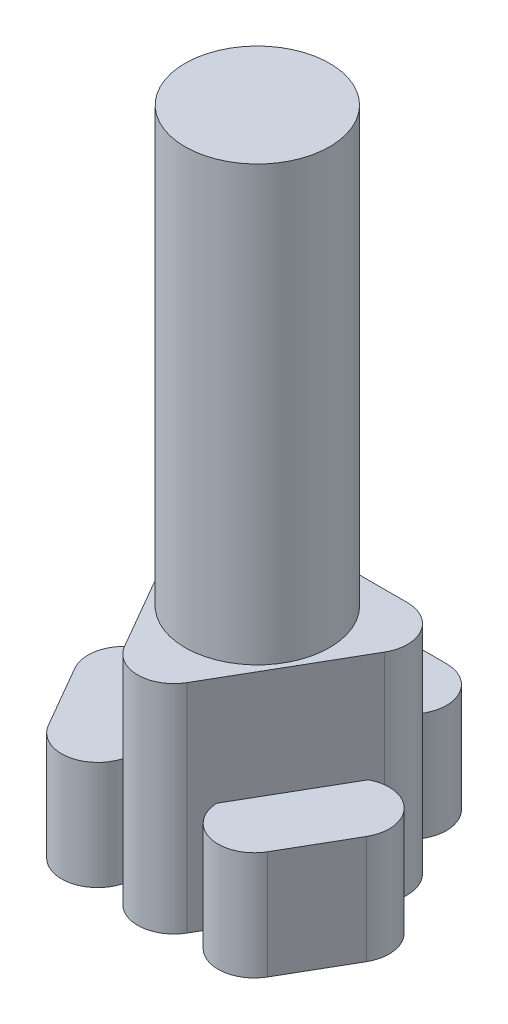
ISO-10303-21;
HEADER;
FILE_DESCRIPTION(('STEP AP214'),'2;1');
FILE_NAME('part.step','',(''),(''),'','','');
FILE_SCHEMA(('AUTOMOTIVE_DESIGN { 1 0 10303 214 1 1 1 1 }'));
ENDSEC;
DATA;
#1=APPLICATION_CONTEXT('core data for automotive mechanical design processes');
#2=APPLICATION_PROTOCOL_DEFINITION('international standard','automotive_design',2000,#1);
#3=PRODUCT_CONTEXT('',#1,'mechanical');
#4=PRODUCT('Part','Part','',(#3));
#5=PRODUCT_RELATED_PRODUCT_CATEGORY('part','',(#4));
#6=PRODUCT_DEFINITION_FORMATION('','',#4);
#7=PRODUCT_DEFINITION_CONTEXT('part definition',#1,'design');
#8=PRODUCT_DEFINITION('design','',#6,#7);
#9=PRODUCT_DEFINITION_SHAPE('','',#8);
#10=(LENGTH_UNIT() NAMED_UNIT(*) SI_UNIT(.MILLI.,.METRE.));
#11=(NAMED_UNIT(*) PLANE_ANGLE_UNIT() SI_UNIT($,.RADIAN.));
#12=(NAMED_UNIT(*) SI_UNIT($,.STERADIAN.) SOLID_ANGLE_UNIT());
#13=UNCERTAINTY_MEASURE_WITH_UNIT(LENGTH_MEASURE(1.E-05),#10,'distance_accuracy_value','');
#14=(GEOMETRIC_REPRESENTATION_CONTEXT(3) GLOBAL_UNCERTAINTY_ASSIGNED_CONTEXT((#13)) GLOBAL_UNIT_ASSIGNED_CONTEXT((#10,
#11,#12)) REPRESENTATION_CONTEXT('',''));
#15=CARTESIAN_POINT('',(0.,0.,0.));
#16=DIRECTION('',(0.,0.,1.));
#17=DIRECTION('',(1.,0.,0.));
#18=AXIS2_PLACEMENT_3D('',#15,#16,#17);
#19=CARTESIAN_POINT('',(-0.31650635094611,0.3,0.0517949192431128));
#20=DIRECTION('',(0.,-1.,0.));
#21=DIRECTION('',(0.,0.,-1.));
#22=AXIS2_PLACEMENT_3D('',#19,#20,#21);
#23=CYLINDRICAL_SURFACE('',#22,0.1);
#24=CARTESIAN_POINT('',(-0.31650635094611,0.,0.0517949192431128));
#25=DIRECTION('',(0.,1.,0.));
#26=DIRECTION('',(0.,0.,1.));
#27=AXIS2_PLACEMENT_3D('',#24,#25,#26);
#28=CIRCLE('',#27,0.1);
#29=CARTESIAN_POINT('',(-0.403108891324553,0.,0.101794919243113));
#30=VERTEX_POINT('',#29);
#31=CARTESIAN_POINT('',(-0.229903810567666,0.,0.00179491924311262));
#32=VERTEX_POINT('',#31);
#33=EDGE_CURVE('E109',#30,#32,#28,.F.);
#34=ORIENTED_EDGE('',*,*,#33,.F.);
#35=DIRECTION('',(0.,-1.,0.));
#36=VECTOR('',#35,1.);
#37=CARTESIAN_POINT('',(-0.403108891324553,0.3,0.101794919243113));
#38=LINE('',#37,#36);
#39=CARTESIAN_POINT('',(-0.403108891324553,0.3,0.101794919243113));
#40=VERTEX_POINT('',#39);
#41=EDGE_CURVE('E12',#40,#30,#38,.T.);
#42=ORIENTED_EDGE('',*,*,#41,.F.);
#43=CARTESIAN_POINT('',(-0.31650635094611,0.3,0.0517949192431128));
#44=DIRECTION('',(0.,1.,0.));
#45=DIRECTION('',(0.,0.,1.));
#46=AXIS2_PLACEMENT_3D('',#43,#44,#45);
#47=CIRCLE('',#46,0.1);
#48=CARTESIAN_POINT('',(-0.229903810567666,0.3,0.00179491924311262));
#49=VERTEX_POINT('',#48);
#50=EDGE_CURVE('E103',#40,#49,#47,.F.);
#51=ORIENTED_EDGE('',*,*,#50,.T.);
#52=DIRECTION('',(0.,-1.,0.));
#53=VECTOR('',#52,1.);
#54=CARTESIAN_POINT('',(-0.229903810567666,0.3,0.00179491924311262));
#55=LINE('',#54,#53);
#56=EDGE_CURVE('E84',#49,#32,#55,.T.);
#57=ORIENTED_EDGE('',*,*,#56,.T.);
#58=EDGE_LOOP('',(#34,#42,#51,#57));
#59=FACE_BOUND('',#58,.T.);
#60=ADVANCED_FACE('F46',(#59),#23,.T.);
#61=CARTESIAN_POINT('',(-0.346410161513776,0.3,0.199999999999999));
#62=DIRECTION('',(-0.86602540378444,0.,0.499999999999998));
#63=DIRECTION('',(0.499999999999998,0.,0.86602540378444));
#64=AXIS2_PLACEMENT_3D('',#61,#62,#63);
#65=PLANE('',#64);
#66=DIRECTION('',(-0.499999999999998,0.,-0.86602540378444));
#67=VECTOR('',#66,1.);
#68=CARTESIAN_POINT('',(-0.346410161513776,0.,0.199999999999999));
#69=LINE('',#68,#67);
#70=CARTESIAN_POINT('',(-0.303108891324554,0.,0.275000000000001));
#71=VERTEX_POINT('',#70);
#72=EDGE_CURVE('E97',#71,#30,#69,.T.);
#73=ORIENTED_EDGE('',*,*,#72,.F.);
#74=DIRECTION('',(0.,-1.,0.));
#75=VECTOR('',#74,1.);
#76=CARTESIAN_POINT('',(-0.303108891324554,0.3,0.275000000000001));
#77=LINE('',#76,#75);
#78=CARTESIAN_POINT('',(-0.303108891324554,0.3,0.275000000000001));
#79=VERTEX_POINT('',#78);
#80=EDGE_CURVE('E54',#79,#71,#77,.T.);
#81=ORIENTED_EDGE('',*,*,#80,.F.);
#82=DIRECTION('',(-0.499999999999998,0.,-0.86602540378444));
#83=VECTOR('',#82,1.);
#84=CARTESIAN_POINT('',(-0.346410161513776,0.3,0.199999999999999));
#85=LINE('',#84,#83);
#86=EDGE_CURVE('E95',#79,#40,#85,.T.);
#87=ORIENTED_EDGE('',*,*,#86,.T.);
#88=ORIENTED_EDGE('',*,*,#41,.T.);
#89=EDGE_LOOP('',(#73,#81,#87,#88));
#90=FACE_BOUND('',#89,.T.);
#91=ADVANCED_FACE('F93',(#90),#65,.T.);
#92=CARTESIAN_POINT('',(-0.21650635094611,0.3,0.225000000000001));
#93=DIRECTION('',(0.,-1.,0.));
#94=DIRECTION('',(0.,0.,-1.));
#95=AXIS2_PLACEMENT_3D('',#92,#93,#94);
#96=CYLINDRICAL_SURFACE('',#95,0.1);
#97=CARTESIAN_POINT('',(-0.21650635094611,0.,0.225000000000001));
#98=DIRECTION('',(0.,1.,0.));
#99=DIRECTION('',(0.,0.,1.));
#100=AXIS2_PLACEMENT_3D('',#97,#98,#99);
#101=CIRCLE('',#100,0.1);
#102=CARTESIAN_POINT('',(-0.129903810567666,0.,0.175000000000001));
#103=VERTEX_POINT('',#102);
#104=EDGE_CURVE('E77',#71,#103,#101,.T.);
#105=ORIENTED_EDGE('',*,*,#104,.T.);
#106=DIRECTION('',(0.,-1.,0.));
#107=VECTOR('',#106,1.);
#108=CARTESIAN_POINT('',(-0.129903810567666,0.3,0.175000000000001));
#109=LINE('',#108,#107);
#110=CARTESIAN_POINT('',(-0.129903810567666,0.3,0.175000000000001));
#111=VERTEX_POINT('',#110);
#112=EDGE_CURVE('E98',#111,#103,#109,.T.);
#113=ORIENTED_EDGE('',*,*,#112,.F.);
#114=CARTESIAN_POINT('',(-0.21650635094611,0.3,0.225000000000001));
#115=DIRECTION('',(0.,1.,0.));
#116=DIRECTION('',(0.,0.,1.));
#117=AXIS2_PLACEMENT_3D('',#114,#115,#116);
#118=CIRCLE('',#117,0.1);
#119=EDGE_CURVE('E99',#79,#111,#118,.T.);
#120=ORIENTED_EDGE('',*,*,#119,.F.);
#121=ORIENTED_EDGE('',*,*,#80,.T.);
#122=EDGE_LOOP('',(#105,#113,#120,#121));
#123=FACE_BOUND('',#122,.T.);
#124=ADVANCED_FACE('F100',(#123),#96,.T.);
#125=CARTESIAN_POINT('',(-0.173205080756888,0.3,0.0999999999999998));
#126=DIRECTION('',(-0.86602540378444,0.,0.499999999999998));
#127=DIRECTION('',(0.499999999999998,0.,0.86602540378444));
#128=AXIS2_PLACEMENT_3D('',#125,#126,#127);
#129=PLANE('',#128);
#130=DIRECTION('',(-0.499999999999998,0.,-0.86602540378444));
#131=VECTOR('',#130,1.);
#132=CARTESIAN_POINT('',(-0.173205080756888,0.,0.0999999999999998));
#133=LINE('',#132,#131);
#134=EDGE_CURVE('E105',#103,#32,#133,.T.);
#135=ORIENTED_EDGE('',*,*,#134,.T.);
#136=ORIENTED_EDGE('',*,*,#56,.F.);
#137=DIRECTION('',(-0.499999999999998,0.,-0.86602540378444));
#138=VECTOR('',#137,1.);
#139=CARTESIAN_POINT('',(-0.173205080756888,0.3,0.0999999999999998));
#140=LINE('',#139,#138);
#141=EDGE_CURVE('E62',#111,#49,#140,.T.);
#142=ORIENTED_EDGE('',*,*,#141,.F.);
#143=ORIENTED_EDGE('',*,*,#112,.T.);
#144=EDGE_LOOP('',(#135,#136,#142,#143));
#145=FACE_BOUND('',#144,.T.);
#146=ADVANCED_FACE('F118',(#145),#129,.F.);
#147=CARTESIAN_POINT('',(0.,0.3,0.));
#148=DIRECTION('',(0.,1.,0.));
#149=DIRECTION('',(0.,0.,1.));
#150=AXIS2_PLACEMENT_3D('',#147,#148,#149);
#151=PLANE('',#150);
#152=ORIENTED_EDGE('',*,*,#50,.F.);
#153=ORIENTED_EDGE('',*,*,#86,.F.);
#154=ORIENTED_EDGE('',*,*,#119,.T.);
#155=ORIENTED_EDGE('',*,*,#141,.T.);
#156=EDGE_LOOP('',(#152,#153,#154,#155));
#157=FACE_BOUND('',#156,.T.);
#158=ADVANCED_FACE('F102',(#157),#151,.T.);
#159=CARTESIAN_POINT('',(0.,0.,0.));
#160=DIRECTION('',(0.,1.,0.));
#161=DIRECTION('',(0.,0.,1.));
#162=AXIS2_PLACEMENT_3D('',#159,#160,#161);
#163=PLANE('',#162);
#164=ORIENTED_EDGE('',*,*,#33,.T.);
#165=ORIENTED_EDGE('',*,*,#134,.F.);
#166=ORIENTED_EDGE('',*,*,#104,.F.);
#167=ORIENTED_EDGE('',*,*,#72,.T.);
#168=EDGE_LOOP('',(#164,#165,#166,#167));
#169=FACE_BOUND('',#168,.T.);
#170=ADVANCED_FACE('F120',(#169),#163,.F.);
#171=CLOSED_SHELL('',(#60,#91,#124,#146,#158,#170));
#172=MANIFOLD_SOLID_BREP('B2',#171);
#173=CARTESIAN_POINT('',(0.216506350946111,0.3,0.224999999999999));
#174=DIRECTION('',(0.,-1.,0.));
#175=DIRECTION('',(0.,0.,-1.));
#176=AXIS2_PLACEMENT_3D('',#173,#174,#175);
#177=CYLINDRICAL_SURFACE('',#176,0.1);
#178=CARTESIAN_POINT('',(0.216506350946111,0.,0.224999999999999));
#179=DIRECTION('',(0.,1.,0.));
#180=DIRECTION('',(0.,0.,1.));
#181=AXIS2_PLACEMENT_3D('',#178,#179,#180);
#182=CIRCLE('',#181,0.1);
#183=CARTESIAN_POINT('',(0.303108891324555,0.,0.274999999999999));
#184=VERTEX_POINT('',#183);
#185=CARTESIAN_POINT('',(0.129903810567666,0.,0.175));
#186=VERTEX_POINT('',#185);
#187=EDGE_CURVE('E244',#184,#186,#182,.F.);
#188=ORIENTED_EDGE('',*,*,#187,.F.);
#189=DIRECTION('',(0.,-1.,0.));
#190=VECTOR('',#189,1.);
#191=CARTESIAN_POINT('',(0.303108891324555,0.3,0.274999999999999));
#192=LINE('',#191,#190);
#193=CARTESIAN_POINT('',(0.303108891324555,0.3,0.274999999999999));
#194=VERTEX_POINT('',#193);
#195=EDGE_CURVE('E44',#194,#184,#192,.T.);
#196=ORIENTED_EDGE('',*,*,#195,.F.);
#197=CARTESIAN_POINT('',(0.216506350946111,0.3,0.224999999999999));
#198=DIRECTION('',(0.,1.,0.));
#199=DIRECTION('',(0.,0.,1.));
#200=AXIS2_PLACEMENT_3D('',#197,#198,#199);
#201=CIRCLE('',#200,0.1);
#202=CARTESIAN_POINT('',(0.129903810567666,0.3,0.175));
#203=VERTEX_POINT('',#202);
#204=EDGE_CURVE('E238',#194,#203,#201,.F.);
#205=ORIENTED_EDGE('',*,*,#204,.T.);
#206=DIRECTION('',(0.,-1.,0.));
#207=VECTOR('',#206,1.);
#208=CARTESIAN_POINT('',(0.129903810567666,0.3,0.175));
#209=LINE('',#208,#207);
#210=EDGE_CURVE('E196',#203,#186,#209,.T.);
#211=ORIENTED_EDGE('',*,*,#210,.T.);
#212=EDGE_LOOP('',(#188,#196,#205,#211));
#213=FACE_BOUND('',#212,.T.);
#214=ADVANCED_FACE('F180',(#213),#177,.T.);
#215=CARTESIAN_POINT('',(0.346410161513776,0.3,0.199999999999999));
#216=DIRECTION('',(0.86602540378444,0.,0.499999999999998));
#217=DIRECTION('',(0.499999999999998,0.,-0.86602540378444));
#218=AXIS2_PLACEMENT_3D('',#215,#216,#217);
#219=PLANE('',#218);
#220=DIRECTION('',(-0.499999999999998,0.,0.86602540378444));
#221=VECTOR('',#220,1.);
#222=CARTESIAN_POINT('',(0.346410161513776,0.,0.199999999999999));
#223=LINE('',#222,#221);
#224=CARTESIAN_POINT('',(0.403108891324554,0.,0.101794919243111));
#225=VERTEX_POINT('',#224);
#226=EDGE_CURVE('E228',#225,#184,#223,.T.);
#227=ORIENTED_EDGE('',*,*,#226,.F.);
#228=DIRECTION('',(0.,-1.,0.));
#229=VECTOR('',#228,1.);
#230=CARTESIAN_POINT('',(0.403108891324554,0.3,0.101794919243111));
#231=LINE('',#230,#229);
#232=CARTESIAN_POINT('',(0.403108891324554,0.3,0.101794919243111));
#233=VERTEX_POINT('',#232);
#234=EDGE_CURVE('E188',#233,#225,#231,.T.);
#235=ORIENTED_EDGE('',*,*,#234,.F.);
#236=DIRECTION('',(-0.499999999999998,0.,0.86602540378444));
#237=VECTOR('',#236,1.);
#238=CARTESIAN_POINT('',(0.346410161513776,0.3,0.199999999999999));
#239=LINE('',#238,#237);
#240=EDGE_CURVE('E226',#233,#194,#239,.T.);
#241=ORIENTED_EDGE('',*,*,#240,.T.);
#242=ORIENTED_EDGE('',*,*,#195,.T.);
#243=EDGE_LOOP('',(#227,#235,#241,#242));
#244=FACE_BOUND('',#243,.T.);
#245=ADVANCED_FACE('F224',(#244),#219,.T.);
#246=CARTESIAN_POINT('',(0.31650635094611,0.3,0.051794919243111));
#247=DIRECTION('',(0.,-1.,0.));
#248=DIRECTION('',(0.,0.,-1.));
#249=AXIS2_PLACEMENT_3D('',#246,#247,#248);
#250=CYLINDRICAL_SURFACE('',#249,0.1);
#251=CARTESIAN_POINT('',(0.31650635094611,0.,0.051794919243111));
#252=DIRECTION('',(0.,1.,0.));
#253=DIRECTION('',(0.,0.,1.));
#254=AXIS2_PLACEMENT_3D('',#251,#252,#253);
#255=CIRCLE('',#254,0.1);
#256=CARTESIAN_POINT('',(0.229903810567666,0.,0.00179491924311166));
#257=VERTEX_POINT('',#256);
#258=EDGE_CURVE('E247',#225,#257,#255,.T.);
#259=ORIENTED_EDGE('',*,*,#258,.T.);
#260=DIRECTION('',(0.,-1.,0.));
#261=VECTOR('',#260,1.);
#262=CARTESIAN_POINT('',(0.229903810567666,0.3,0.00179491924311166));
#263=LINE('',#262,#261);
#264=CARTESIAN_POINT('',(0.229903810567666,0.3,0.00179491924311166));
#265=VERTEX_POINT('',#264);
#266=EDGE_CURVE('E210',#265,#257,#263,.T.);
#267=ORIENTED_EDGE('',*,*,#266,.F.);
#268=CARTESIAN_POINT('',(0.31650635094611,0.3,0.051794919243111));
#269=DIRECTION('',(0.,1.,0.));
#270=DIRECTION('',(0.,0.,1.));
#271=AXIS2_PLACEMENT_3D('',#268,#269,#270);
#272=CIRCLE('',#271,0.1);
#273=EDGE_CURVE('E231',#233,#265,#272,.T.);
#274=ORIENTED_EDGE('',*,*,#273,.F.);
#275=ORIENTED_EDGE('',*,*,#234,.T.);
#276=EDGE_LOOP('',(#259,#267,#274,#275));
#277=FACE_BOUND('',#276,.T.);
#278=ADVANCED_FACE('F232',(#277),#250,.T.);
#279=CARTESIAN_POINT('',(0.173205080756888,0.3,0.0999999999999998));
#280=DIRECTION('',(-0.866025403784439,0.,-0.499999999999999));
#281=DIRECTION('',(-0.499999999999999,0.,0.866025403784439));
#282=AXIS2_PLACEMENT_3D('',#279,#280,#281);
#283=PLANE('',#282);
#284=DIRECTION('',(0.499999999999999,0.,-0.86602540378444));
#285=VECTOR('',#284,1.);
#286=CARTESIAN_POINT('',(0.173205080756888,0.,0.0999999999999998));
#287=LINE('',#286,#285);
#288=EDGE_CURVE('E240',#186,#257,#287,.T.);
#289=ORIENTED_EDGE('',*,*,#288,.F.);
#290=ORIENTED_EDGE('',*,*,#210,.F.);
#291=DIRECTION('',(0.499999999999999,0.,-0.86602540378444));
#292=VECTOR('',#291,1.);
#293=CARTESIAN_POINT('',(0.173205080756888,0.3,0.0999999999999998));
#294=LINE('',#293,#292);
#295=EDGE_CURVE('E235',#203,#265,#294,.T.);
#296=ORIENTED_EDGE('',*,*,#295,.T.);
#297=ORIENTED_EDGE('',*,*,#266,.T.);
#298=EDGE_LOOP('',(#289,#290,#296,#297));
#299=FACE_BOUND('',#298,.T.);
#300=ADVANCED_FACE('F254',(#299),#283,.T.);
#301=CARTESIAN_POINT('',(0.,0.3,0.));
#302=DIRECTION('',(0.,1.,0.));
#303=DIRECTION('',(0.,0.,1.));
#304=AXIS2_PLACEMENT_3D('',#301,#302,#303);
#305=PLANE('',#304);
#306=ORIENTED_EDGE('',*,*,#204,.F.);
#307=ORIENTED_EDGE('',*,*,#240,.F.);
#308=ORIENTED_EDGE('',*,*,#273,.T.);
#309=ORIENTED_EDGE('',*,*,#295,.F.);
#310=EDGE_LOOP('',(#306,#307,#308,#309));
#311=FACE_BOUND('',#310,.T.);
#312=ADVANCED_FACE('F237',(#311),#305,.T.);
#313=CARTESIAN_POINT('',(0.,0.,0.));
#314=DIRECTION('',(0.,1.,0.));
#315=DIRECTION('',(0.,0.,1.));
#316=AXIS2_PLACEMENT_3D('',#313,#314,#315);
#317=PLANE('',#316);
#318=ORIENTED_EDGE('',*,*,#187,.T.);
#319=ORIENTED_EDGE('',*,*,#288,.T.);
#320=ORIENTED_EDGE('',*,*,#258,.F.);
#321=ORIENTED_EDGE('',*,*,#226,.T.);
#322=EDGE_LOOP('',(#318,#319,#320,#321));
#323=FACE_BOUND('',#322,.T.);
#324=ADVANCED_FACE('F253',(#323),#317,.F.);
#325=CLOSED_SHELL('',(#214,#245,#278,#300,#312,#324));
#326=MANIFOLD_SOLID_BREP('B6',#325);
#327=CARTESIAN_POINT('',(0.,0.3,-0.223205080756888));
#328=DIRECTION('',(0.,0.,1.));
#329=DIRECTION('',(1.,0.,0.));
#330=AXIS2_PLACEMENT_3D('',#327,#328,#329);
#331=PLANE('',#330);
#332=DIRECTION('',(-1.,0.,0.));
#333=VECTOR('',#332,1.);
#334=CARTESIAN_POINT('',(0.,0.,-0.223205080756888));
#335=LINE('',#334,#333);
#336=CARTESIAN_POINT('',(0.0999999999999999,0.,-0.223205080756888));
#337=VERTEX_POINT('',#336);
#338=CARTESIAN_POINT('',(-0.1,0.,-0.223205080756888));
#339=VERTEX_POINT('',#338);
#340=EDGE_CURVE('E376',#337,#339,#335,.T.);
#341=ORIENTED_EDGE('',*,*,#340,.F.);
#342=DIRECTION('',(0.,-1.,0.));
#343=VECTOR('',#342,1.);
#344=CARTESIAN_POINT('',(0.0999999999999999,0.3,-0.223205080756888));
#345=LINE('',#344,#343);
#346=CARTESIAN_POINT('',(0.0999999999999999,0.3,-0.223205080756888));
#347=VERTEX_POINT('',#346);
#348=EDGE_CURVE('E178',#347,#337,#345,.T.);
#349=ORIENTED_EDGE('',*,*,#348,.F.);
#350=DIRECTION('',(-1.,0.,0.));
#351=VECTOR('',#350,1.);
#352=CARTESIAN_POINT('',(0.,0.3,-0.223205080756888));
#353=LINE('',#352,#351);
#354=CARTESIAN_POINT('',(-0.1,0.3,-0.223205080756888));
#355=VERTEX_POINT('',#354);
#356=EDGE_CURVE('E361',#347,#355,#353,.T.);
#357=ORIENTED_EDGE('',*,*,#356,.T.);
#358=DIRECTION('',(0.,-1.,0.));
#359=VECTOR('',#358,1.);
#360=CARTESIAN_POINT('',(-0.1,0.3,-0.223205080756888));
#361=LINE('',#360,#359);
#362=EDGE_CURVE('E329',#355,#339,#361,.T.);
#363=ORIENTED_EDGE('',*,*,#362,.T.);
#364=EDGE_LOOP('',(#341,#349,#357,#363));
#365=FACE_BOUND('',#364,.T.);
#366=ADVANCED_FACE('F313',(#365),#331,.T.);
#367=CARTESIAN_POINT('',(0.0999999999999995,0.3,-0.323205080756888));
#368=DIRECTION('',(0.,-1.,0.));
#369=DIRECTION('',(0.,0.,-1.));
#370=AXIS2_PLACEMENT_3D('',#367,#368,#369);
#371=CYLINDRICAL_SURFACE('',#370,0.1);
#372=CARTESIAN_POINT('',(0.0999999999999995,0.,-0.323205080756888));
#373=DIRECTION('',(0.,1.,0.));
#374=DIRECTION('',(0.,0.,1.));
#375=AXIS2_PLACEMENT_3D('',#372,#373,#374);
#376=CIRCLE('',#375,0.1);
#377=CARTESIAN_POINT('',(0.0999999999999992,0.,-0.423205080756888));
#378=VERTEX_POINT('',#377);
#379=EDGE_CURVE('E367',#337,#378,#376,.T.);
#380=ORIENTED_EDGE('',*,*,#379,.T.);
#381=DIRECTION('',(0.,-1.,0.));
#382=VECTOR('',#381,1.);
#383=CARTESIAN_POINT('',(0.0999999999999992,0.3,-0.423205080756888));
#384=LINE('',#383,#382);
#385=CARTESIAN_POINT('',(0.0999999999999992,0.3,-0.423205080756888));
#386=VERTEX_POINT('',#385);
#387=EDGE_CURVE('E321',#386,#378,#384,.T.);
#388=ORIENTED_EDGE('',*,*,#387,.F.);
#389=CARTESIAN_POINT('',(0.0999999999999995,0.3,-0.323205080756888));
#390=DIRECTION('',(0.,1.,0.));
#391=DIRECTION('',(0.,0.,1.));
#392=AXIS2_PLACEMENT_3D('',#389,#390,#391);
#393=CIRCLE('',#392,0.1);
#394=EDGE_CURVE('E355',#347,#386,#393,.T.);
#395=ORIENTED_EDGE('',*,*,#394,.F.);
#396=ORIENTED_EDGE('',*,*,#348,.T.);
#397=EDGE_LOOP('',(#380,#388,#395,#396));
#398=FACE_BOUND('',#397,.T.);
#399=ADVANCED_FACE('F365',(#398),#371,.T.);
#400=CARTESIAN_POINT('',(0.,0.3,-0.423205080756888));
#401=DIRECTION('',(0.,0.,1.));
#402=DIRECTION('',(1.,0.,0.));
#403=AXIS2_PLACEMENT_3D('',#400,#401,#402);
#404=PLANE('',#403);
#405=DIRECTION('',(-1.,0.,0.));
#406=VECTOR('',#405,1.);
#407=CARTESIAN_POINT('',(0.,0.,-0.423205080756888));
#408=LINE('',#407,#406);
#409=CARTESIAN_POINT('',(-0.100000000000001,0.,-0.423205080756888));
#410=VERTEX_POINT('',#409);
#411=EDGE_CURVE('E379',#378,#410,#408,.T.);
#412=ORIENTED_EDGE('',*,*,#411,.T.);
#413=DIRECTION('',(0.,-1.,0.));
#414=VECTOR('',#413,1.);
#415=CARTESIAN_POINT('',(-0.100000000000001,0.3,-0.423205080756888));
#416=LINE('',#415,#414);
#417=CARTESIAN_POINT('',(-0.100000000000001,0.3,-0.423205080756888));
#418=VERTEX_POINT('',#417);
#419=EDGE_CURVE('E343',#418,#410,#416,.T.);
#420=ORIENTED_EDGE('',*,*,#419,.F.);
#421=DIRECTION('',(-1.,0.,0.));
#422=VECTOR('',#421,1.);
#423=CARTESIAN_POINT('',(0.,0.3,-0.423205080756888));
#424=LINE('',#423,#422);
#425=EDGE_CURVE('E360',#386,#418,#424,.T.);
#426=ORIENTED_EDGE('',*,*,#425,.F.);
#427=ORIENTED_EDGE('',*,*,#387,.T.);
#428=EDGE_LOOP('',(#412,#420,#426,#427));
#429=FACE_BOUND('',#428,.T.);
#430=ADVANCED_FACE('F370',(#429),#404,.F.);
#431=CARTESIAN_POINT('',(-0.100000000000001,0.3,-0.323205080756888));
#432=DIRECTION('',(0.,-1.,0.));
#433=DIRECTION('',(0.,0.,-1.));
#434=AXIS2_PLACEMENT_3D('',#431,#432,#433);
#435=CYLINDRICAL_SURFACE('',#434,0.1);
#436=CARTESIAN_POINT('',(-0.100000000000001,0.,-0.323205080756888));
#437=DIRECTION('',(0.,1.,0.));
#438=DIRECTION('',(0.,0.,1.));
#439=AXIS2_PLACEMENT_3D('',#436,#437,#438);
#440=CIRCLE('',#439,0.1);
#441=EDGE_CURVE('E381',#339,#410,#440,.F.);
#442=ORIENTED_EDGE('',*,*,#441,.F.);
#443=ORIENTED_EDGE('',*,*,#362,.F.);
#444=CARTESIAN_POINT('',(-0.100000000000001,0.3,-0.323205080756888));
#445=DIRECTION('',(0.,1.,0.));
#446=DIRECTION('',(0.,0.,1.));
#447=AXIS2_PLACEMENT_3D('',#444,#445,#446);
#448=CIRCLE('',#447,0.1);
#449=EDGE_CURVE('E371',#355,#418,#448,.F.);
#450=ORIENTED_EDGE('',*,*,#449,.T.);
#451=ORIENTED_EDGE('',*,*,#419,.T.);
#452=EDGE_LOOP('',(#442,#443,#450,#451));
#453=FACE_BOUND('',#452,.T.);
#454=ADVANCED_FACE('F386',(#453),#435,.T.);
#455=CARTESIAN_POINT('',(0.,0.3,0.));
#456=DIRECTION('',(0.,1.,0.));
#457=DIRECTION('',(0.,0.,1.));
#458=AXIS2_PLACEMENT_3D('',#455,#456,#457);
#459=PLANE('',#458);
#460=ORIENTED_EDGE('',*,*,#356,.F.);
#461=ORIENTED_EDGE('',*,*,#394,.T.);
#462=ORIENTED_EDGE('',*,*,#425,.T.);
#463=ORIENTED_EDGE('',*,*,#449,.F.);
#464=EDGE_LOOP('',(#460,#461,#462,#463));
#465=FACE_BOUND('',#464,.T.);
#466=ADVANCED_FACE('F357',(#465),#459,.T.);
#467=CARTESIAN_POINT('',(0.,0.,0.));
#468=DIRECTION('',(0.,1.,0.));
#469=DIRECTION('',(0.,0.,1.));
#470=AXIS2_PLACEMENT_3D('',#467,#468,#469);
#471=PLANE('',#470);
#472=ORIENTED_EDGE('',*,*,#340,.T.);
#473=ORIENTED_EDGE('',*,*,#441,.T.);
#474=ORIENTED_EDGE('',*,*,#411,.F.);
#475=ORIENTED_EDGE('',*,*,#379,.F.);
#476=EDGE_LOOP('',(#472,#473,#474,#475));
#477=FACE_BOUND('',#476,.T.);
#478=ADVANCED_FACE('F393',(#477),#471,.F.);
#479=CLOSED_SHELL('',(#366,#399,#430,#454,#466,#478));
#480=MANIFOLD_SOLID_BREP('B38',#479);
#481=CARTESIAN_POINT('',(0.2,0.6,-0.115470053837925));
#482=DIRECTION('',(0.,-1.,0.));
#483=DIRECTION('',(0.,0.,-1.));
#484=AXIS2_PLACEMENT_3D('',#481,#482,#483);
#485=CYLINDRICAL_SURFACE('',#484,0.1);
#486=CARTESIAN_POINT('',(0.2,0.,-0.115470053837925));
#487=DIRECTION('',(0.,1.,0.));
#488=DIRECTION('',(0.,0.,1.));
#489=AXIS2_PLACEMENT_3D('',#486,#487,#488);
#490=CIRCLE('',#489,0.1);
#491=CARTESIAN_POINT('',(0.286602540378444,0.,-0.0654700538379251));
#492=VERTEX_POINT('',#491);
#493=CARTESIAN_POINT('',(0.2,0.,-0.215470053837925));
#494=VERTEX_POINT('',#493);
#495=EDGE_CURVE('E521',#492,#494,#490,.T.);
#496=ORIENTED_EDGE('',*,*,#495,.T.);
#497=DIRECTION('',(0.,-1.,0.));
#498=VECTOR('',#497,1.);
#499=CARTESIAN_POINT('',(0.2,0.6,-0.215470053837925));
#500=LINE('',#499,#498);
#501=CARTESIAN_POINT('',(0.2,0.6,-0.215470053837925));
#502=VERTEX_POINT('',#501);
#503=EDGE_CURVE('E311',#502,#494,#500,.T.);
#504=ORIENTED_EDGE('',*,*,#503,.F.);
#505=CARTESIAN_POINT('',(0.2,0.6,-0.115470053837925));
#506=DIRECTION('',(0.,1.,0.));
#507=DIRECTION('',(0.,0.,1.));
#508=AXIS2_PLACEMENT_3D('',#505,#506,#507);
#509=CIRCLE('',#508,0.1);
#510=CARTESIAN_POINT('',(0.286602540378444,0.6,-0.0654700538379251));
#511=VERTEX_POINT('',#510);
#512=EDGE_CURVE('E532',#511,#502,#509,.T.);
#513=ORIENTED_EDGE('',*,*,#512,.F.);
#514=DIRECTION('',(0.,-1.,0.));
#515=VECTOR('',#514,1.);
#516=CARTESIAN_POINT('',(0.286602540378444,0.6,-0.0654700538379251));
#517=LINE('',#516,#515);
#518=EDGE_CURVE('E517',#511,#492,#517,.T.);
#519=ORIENTED_EDGE('',*,*,#518,.T.);
#520=EDGE_LOOP('',(#496,#504,#513,#519));
#521=FACE_BOUND('',#520,.T.);
#522=ADVANCED_FACE('F437',(#521),#485,.T.);
#523=CARTESIAN_POINT('',(0.2,0.6,-0.215470053837925));
#524=DIRECTION('',(0.,0.,1.));
#525=DIRECTION('',(1.,0.,0.));
#526=AXIS2_PLACEMENT_3D('',#523,#524,#525);
#527=PLANE('',#526);
#528=DIRECTION('',(-1.,0.,0.));
#529=VECTOR('',#528,1.);
#530=CARTESIAN_POINT('',(0.2,0.,-0.215470053837925));
#531=LINE('',#530,#529);
#532=CARTESIAN_POINT('',(-0.2,0.,-0.215470053837925));
#533=VERTEX_POINT('',#532);
#534=EDGE_CURVE('E524',#494,#533,#531,.T.);
#535=ORIENTED_EDGE('',*,*,#534,.T.);
#536=DIRECTION('',(0.,-1.,0.));
#537=VECTOR('',#536,1.);
#538=CARTESIAN_POINT('',(-0.2,0.6,-0.215470053837925));
#539=LINE('',#538,#537);
#540=CARTESIAN_POINT('',(-0.2,0.6,-0.215470053837925));
#541=VERTEX_POINT('',#540);
#542=EDGE_CURVE('E445',#541,#533,#539,.T.);
#543=ORIENTED_EDGE('',*,*,#542,.F.);
#544=DIRECTION('',(-1.,0.,0.));
#545=VECTOR('',#544,1.);
#546=CARTESIAN_POINT('',(0.2,0.6,-0.215470053837925));
#547=LINE('',#546,#545);
#548=EDGE_CURVE('E490',#502,#541,#547,.T.);
#549=ORIENTED_EDGE('',*,*,#548,.F.);
#550=ORIENTED_EDGE('',*,*,#503,.T.);
#551=EDGE_LOOP('',(#535,#543,#549,#550));
#552=FACE_BOUND('',#551,.T.);
#553=ADVANCED_FACE('F557',(#552),#527,.F.);
#554=CARTESIAN_POINT('',(-0.2,0.6,-0.115470053837925));
#555=DIRECTION('',(0.,-1.,0.));
#556=DIRECTION('',(0.,0.,-1.));
#557=AXIS2_PLACEMENT_3D('',#554,#555,#556);
#558=CYLINDRICAL_SURFACE('',#557,0.1);
#559=CARTESIAN_POINT('',(-0.2,0.,-0.115470053837925));
#560=DIRECTION('',(0.,1.,0.));
#561=DIRECTION('',(0.,0.,1.));
#562=AXIS2_PLACEMENT_3D('',#559,#560,#561);
#563=CIRCLE('',#562,0.1);
#564=CARTESIAN_POINT('',(-0.286602540378444,0.,-0.0654700538379252));
#565=VERTEX_POINT('',#564);
#566=EDGE_CURVE('E527',#533,#565,#563,.T.);
#567=ORIENTED_EDGE('',*,*,#566,.T.);
#568=DIRECTION('',(0.,-1.,0.));
#569=VECTOR('',#568,1.);
#570=CARTESIAN_POINT('',(-0.286602540378444,0.6,-0.0654700538379252));
#571=LINE('',#570,#569);
#572=CARTESIAN_POINT('',(-0.286602540378444,0.6,-0.0654700538379252));
#573=VERTEX_POINT('',#572);
#574=EDGE_CURVE('E512',#573,#565,#571,.T.);
#575=ORIENTED_EDGE('',*,*,#574,.F.);
#576=CARTESIAN_POINT('',(-0.2,0.6,-0.115470053837925));
#577=DIRECTION('',(0.,1.,0.));
#578=DIRECTION('',(0.,0.,1.));
#579=AXIS2_PLACEMENT_3D('',#576,#577,#578);
#580=CIRCLE('',#579,0.1);
#581=EDGE_CURVE('E503',#541,#573,#580,.T.);
#582=ORIENTED_EDGE('',*,*,#581,.F.);
#583=ORIENTED_EDGE('',*,*,#542,.T.);
#584=EDGE_LOOP('',(#567,#575,#582,#583));
#585=FACE_BOUND('',#584,.T.);
#586=ADVANCED_FACE('F538',(#585),#558,.T.);
#587=CARTESIAN_POINT('',(-0.0866025403784439,0.6,0.28094010767585));
#588=DIRECTION('',(0.866025403784438,0.,-0.5));
#589=DIRECTION('',(-0.5,0.,-0.866025403784439));
#590=AXIS2_PLACEMENT_3D('',#587,#588,#589);
#591=PLANE('',#590);
#592=DIRECTION('',(0.5,0.,0.866025403784439));
#593=VECTOR('',#592,1.);
#594=CARTESIAN_POINT('',(-0.0866025403784439,0.,0.28094010767585));
#595=LINE('',#594,#593);
#596=CARTESIAN_POINT('',(-0.0866025403784439,0.,0.28094010767585));
#597=VERTEX_POINT('',#596);
#598=EDGE_CURVE('E511',#565,#597,#595,.T.);
#599=ORIENTED_EDGE('',*,*,#598,.T.);
#600=DIRECTION('',(0.,-1.,0.));
#601=VECTOR('',#600,1.);
#602=CARTESIAN_POINT('',(-0.0866025403784439,0.6,0.28094010767585));
#603=LINE('',#602,#601);
#604=CARTESIAN_POINT('',(-0.0866025403784439,0.6,0.28094010767585));
#605=VERTEX_POINT('',#604);
#606=EDGE_CURVE('E508',#605,#597,#603,.T.);
#607=ORIENTED_EDGE('',*,*,#606,.F.);
#608=DIRECTION('',(0.5,0.,0.866025403784439));
#609=VECTOR('',#608,1.);
#610=CARTESIAN_POINT('',(-0.0866025403784439,0.6,0.28094010767585));
#611=LINE('',#610,#609);
#612=EDGE_CURVE('E497',#573,#605,#611,.T.);
#613=ORIENTED_EDGE('',*,*,#612,.F.);
#614=ORIENTED_EDGE('',*,*,#574,.T.);
#615=EDGE_LOOP('',(#599,#607,#613,#614));
#616=FACE_BOUND('',#615,.T.);
#617=ADVANCED_FACE('F509',(#616),#591,.F.);
#618=CARTESIAN_POINT('',(0.,0.6,0.23094010767585));
#619=DIRECTION('',(0.,-1.,0.));
#620=DIRECTION('',(0.,0.,-1.));
#621=AXIS2_PLACEMENT_3D('',#618,#619,#620);
#622=CYLINDRICAL_SURFACE('',#621,0.1);
#623=CARTESIAN_POINT('',(0.,0.,0.23094010767585));
#624=DIRECTION('',(0.,1.,0.));
#625=DIRECTION('',(0.,0.,1.));
#626=AXIS2_PLACEMENT_3D('',#623,#624,#625);
#627=CIRCLE('',#626,0.1);
#628=CARTESIAN_POINT('',(0.0866025403784439,0.,0.28094010767585));
#629=VERTEX_POINT('',#628);
#630=EDGE_CURVE('E476',#597,#629,#627,.T.);
#631=ORIENTED_EDGE('',*,*,#630,.T.);
#632=DIRECTION('',(0.,-1.,0.));
#633=VECTOR('',#632,1.);
#634=CARTESIAN_POINT('',(0.0866025403784439,0.6,0.28094010767585));
#635=LINE('',#634,#633);
#636=CARTESIAN_POINT('',(0.0866025403784439,0.6,0.28094010767585));
#637=VERTEX_POINT('',#636);
#638=EDGE_CURVE('E513',#637,#629,#635,.T.);
#639=ORIENTED_EDGE('',*,*,#638,.F.);
#640=CARTESIAN_POINT('',(0.,0.6,0.23094010767585));
#641=DIRECTION('',(0.,1.,0.));
#642=DIRECTION('',(0.,0.,1.));
#643=AXIS2_PLACEMENT_3D('',#640,#641,#642);
#644=CIRCLE('',#643,0.1);
#645=EDGE_CURVE('E501',#605,#637,#644,.T.);
#646=ORIENTED_EDGE('',*,*,#645,.F.);
#647=ORIENTED_EDGE('',*,*,#606,.T.);
#648=EDGE_LOOP('',(#631,#639,#646,#647));
#649=FACE_BOUND('',#648,.T.);
#650=ADVANCED_FACE('F515',(#649),#622,.T.);
#651=CARTESIAN_POINT('',(0.286602540378444,0.6,-0.0654700538379251));
#652=DIRECTION('',(-0.866025403784439,0.,-0.5));
#653=DIRECTION('',(-0.5,0.,0.866025403784439));
#654=AXIS2_PLACEMENT_3D('',#651,#652,#653);
#655=PLANE('',#654);
#656=DIRECTION('',(0.5,0.,-0.866025403784438));
#657=VECTOR('',#656,1.);
#658=CARTESIAN_POINT('',(0.286602540378444,0.,-0.0654700538379251));
#659=LINE('',#658,#657);
#660=EDGE_CURVE('E482',#629,#492,#659,.T.);
#661=ORIENTED_EDGE('',*,*,#660,.T.);
#662=ORIENTED_EDGE('',*,*,#518,.F.);
#663=DIRECTION('',(0.5,0.,-0.866025403784438));
#664=VECTOR('',#663,1.);
#665=CARTESIAN_POINT('',(0.286602540378444,0.6,-0.0654700538379251));
#666=LINE('',#665,#664);
#667=EDGE_CURVE('E453',#637,#511,#666,.T.);
#668=ORIENTED_EDGE('',*,*,#667,.F.);
#669=ORIENTED_EDGE('',*,*,#638,.T.);
#670=EDGE_LOOP('',(#661,#662,#668,#669));
#671=FACE_BOUND('',#670,.T.);
#672=ADVANCED_FACE('F545',(#671),#655,.F.);
#673=CARTESIAN_POINT('',(0.2,0.6,-0.115470053837925));
#674=DIRECTION('',(0.,1.,0.));
#675=DIRECTION('',(0.,0.,1.));
#676=AXIS2_PLACEMENT_3D('',#673,#674,#675);
#677=PLANE('',#676);
#678=CARTESIAN_POINT('',(0.,0.6,0.));
#679=DIRECTION('',(0.,1.,0.));
#680=DIRECTION('',(0.,0.,1.));
#681=AXIS2_PLACEMENT_3D('',#678,#679,#680);
#682=CIRCLE('',#681,0.2);
#683=CARTESIAN_POINT('',(0.,0.6,0.2));
#684=VERTEX_POINT('',#683);
#685=EDGE_CURVE('E618',#684,#684,#682,.T.);
#686=ORIENTED_EDGE('',*,*,#685,.F.);
#687=EDGE_LOOP('',(#686));
#688=FACE_BOUND('',#687,.T.);
#689=ORIENTED_EDGE('',*,*,#512,.T.);
#690=ORIENTED_EDGE('',*,*,#548,.T.);
#691=ORIENTED_EDGE('',*,*,#581,.T.);
#692=ORIENTED_EDGE('',*,*,#612,.T.);
#693=ORIENTED_EDGE('',*,*,#645,.T.);
#694=ORIENTED_EDGE('',*,*,#667,.T.);
#695=EDGE_LOOP('',(#689,#690,#691,#692,#693,#694));
#696=FACE_BOUND('',#695,.T.);
#697=ADVANCED_FACE('F499',(#688,#696),#677,.T.);
#698=CARTESIAN_POINT('',(0.2,0.,-0.115470053837925));
#699=DIRECTION('',(0.,1.,0.));
#700=DIRECTION('',(0.,0.,1.));
#701=AXIS2_PLACEMENT_3D('',#698,#699,#700);
#702=PLANE('',#701);
#703=ORIENTED_EDGE('',*,*,#495,.F.);
#704=ORIENTED_EDGE('',*,*,#660,.F.);
#705=ORIENTED_EDGE('',*,*,#630,.F.);
#706=ORIENTED_EDGE('',*,*,#598,.F.);
#707=ORIENTED_EDGE('',*,*,#566,.F.);
#708=ORIENTED_EDGE('',*,*,#534,.F.);
#709=EDGE_LOOP('',(#703,#704,#705,#706,#707,#708));
#710=FACE_BOUND('',#709,.T.);
#711=ADVANCED_FACE('F541',(#710),#702,.F.);
#712=CARTESIAN_POINT('',(0.,1.8,0.));
#713=DIRECTION('',(0.,-1.,0.));
#714=DIRECTION('',(0.,0.,-1.));
#715=AXIS2_PLACEMENT_3D('',#712,#713,#714);
#716=CYLINDRICAL_SURFACE('',#715,0.2);
#717=CARTESIAN_POINT('',(0.,1.8,0.));
#718=DIRECTION('',(0.,1.,0.));
#719=DIRECTION('',(0.,0.,1.));
#720=AXIS2_PLACEMENT_3D('',#717,#718,#719);
#721=CIRCLE('',#720,0.2);
#722=CARTESIAN_POINT('',(0.,1.8,0.2));
#723=VERTEX_POINT('',#722);
#724=EDGE_CURVE('E525',#723,#723,#721,.T.);
#725=ORIENTED_EDGE('',*,*,#724,.F.);
#726=EDGE_LOOP('',(#725));
#727=FACE_BOUND('',#726,.T.);
#728=ORIENTED_EDGE('',*,*,#685,.T.);
#729=EDGE_LOOP('',(#728));
#730=FACE_BOUND('',#729,.T.);
#731=ADVANCED_FACE('F589',(#727,#730),#716,.T.);
#732=CARTESIAN_POINT('',(0.,1.8,0.));
#733=DIRECTION('',(0.,1.,0.));
#734=DIRECTION('',(0.,0.,1.));
#735=AXIS2_PLACEMENT_3D('',#732,#733,#734);
#736=PLANE('',#735);
#737=ORIENTED_EDGE('',*,*,#724,.T.);
#738=EDGE_LOOP('',(#737));
#739=FACE_BOUND('',#738,.T.);
#740=ADVANCED_FACE('F602',(#739),#736,.T.);
#741=CLOSED_SHELL('',(#522,#553,#586,#617,#650,#672,#697,#711,#731,#740));
#742=MANIFOLD_SOLID_BREP('B172',#741);
#743=ADVANCED_BREP_SHAPE_REPRESENTATION('',(#18,#172,#326,#480,#742),#14);
#744=SHAPE_DEFINITION_REPRESENTATION(#9,#743);
ENDSEC;
END-ISO-10303-21;
